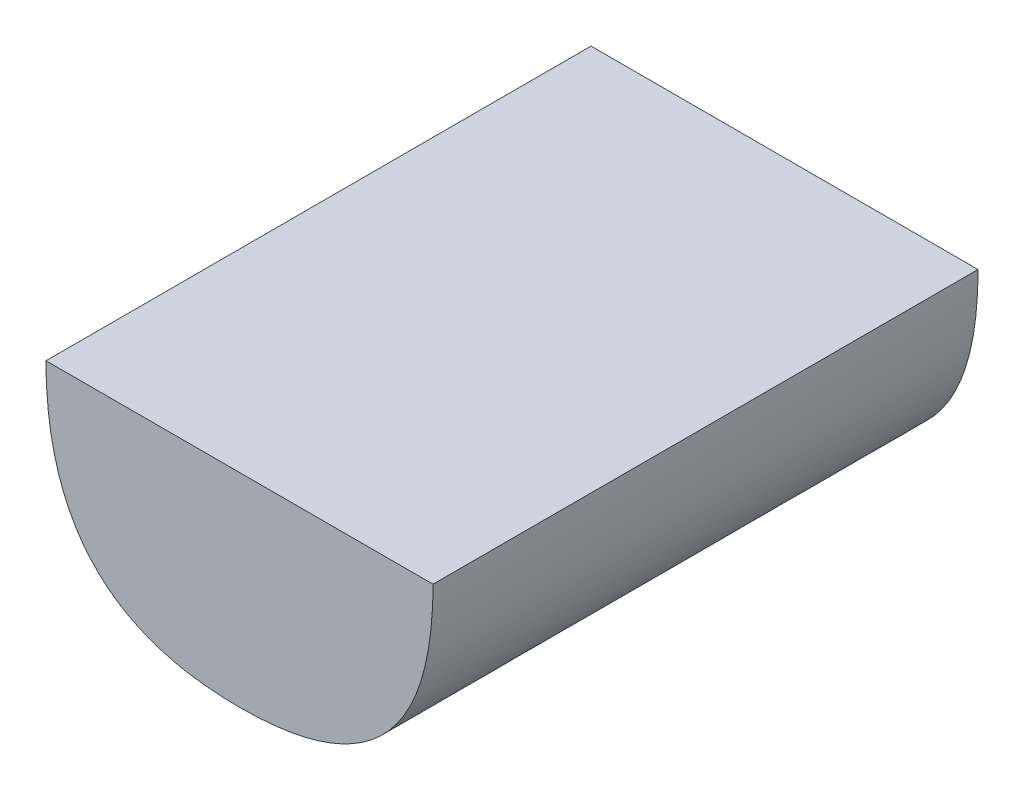
ISO-10303-21;
HEADER;
FILE_DESCRIPTION(('STEP AP214'),'2;1');
FILE_NAME('part.step','',(''),(''),'','','');
FILE_SCHEMA(('AUTOMOTIVE_DESIGN { 1 0 10303 214 1 1 1 1 }'));
ENDSEC;
DATA;
#1=APPLICATION_CONTEXT('core data for automotive mechanical design processes');
#2=APPLICATION_PROTOCOL_DEFINITION('international standard','automotive_design',2000,#1);
#3=PRODUCT_CONTEXT('',#1,'mechanical');
#4=PRODUCT('Part','Part','',(#3));
#5=PRODUCT_RELATED_PRODUCT_CATEGORY('part','',(#4));
#6=PRODUCT_DEFINITION_FORMATION('','',#4);
#7=PRODUCT_DEFINITION_CONTEXT('part definition',#1,'design');
#8=PRODUCT_DEFINITION('design','',#6,#7);
#9=PRODUCT_DEFINITION_SHAPE('','',#8);
#10=(LENGTH_UNIT() NAMED_UNIT(*) SI_UNIT(.MILLI.,.METRE.));
#11=(NAMED_UNIT(*) PLANE_ANGLE_UNIT() SI_UNIT($,.RADIAN.));
#12=(NAMED_UNIT(*) SI_UNIT($,.STERADIAN.) SOLID_ANGLE_UNIT());
#13=UNCERTAINTY_MEASURE_WITH_UNIT(LENGTH_MEASURE(1.E-05),#10,'distance_accuracy_value','');
#14=(GEOMETRIC_REPRESENTATION_CONTEXT(3) GLOBAL_UNCERTAINTY_ASSIGNED_CONTEXT((#13)) GLOBAL_UNIT_ASSIGNED_CONTEXT((#10,
#11,#12)) REPRESENTATION_CONTEXT('',''));
#15=CARTESIAN_POINT('',(0.,0.,0.));
#16=DIRECTION('',(0.,0.,1.));
#17=DIRECTION('',(1.,0.,0.));
#18=AXIS2_PLACEMENT_3D('',#15,#16,#17);
#19=CARTESIAN_POINT('',(0.,0.,-851.662));
#20=CARTESIAN_POINT('',(-302.357037840975,-0.0664450020700911,-851.662));
#21=CARTESIAN_POINT('',(-302.357037840975,317.813001305344,-851.662));
#22=(BOUNDED_CURVE() B_SPLINE_CURVE(2,(#19,#20,#21),.UNSPECIFIED.,.F.,
.F.) B_SPLINE_CURVE_WITH_KNOTS((3,3),(0.,1.),
.UNSPECIFIED.) CURVE() GEOMETRIC_REPRESENTATION_ITEM() RATIONAL_B_SPLINE_CURVE((1.,
1.01936959538977,1.)) REPRESENTATION_ITEM(''));
#23=DIRECTION('',(0.,0.,1.));
#24=VECTOR('',#23,1.);
#25=SURFACE_OF_LINEAR_EXTRUSION('',#22,#24);
#26=CARTESIAN_POINT('',(0.,0.,0.));
#27=CARTESIAN_POINT('',(-302.357037840975,-0.0664450020700911,0.));
#28=CARTESIAN_POINT('',(-302.357037840975,317.813001305344,0.));
#29=(BOUNDED_CURVE() B_SPLINE_CURVE(2,(#26,#27,#28),.UNSPECIFIED.,.F.,
.F.) B_SPLINE_CURVE_WITH_KNOTS((3,3),(0.,1.),
.UNSPECIFIED.) CURVE() GEOMETRIC_REPRESENTATION_ITEM() RATIONAL_B_SPLINE_CURVE((1.,
1.01936959538977,1.)) REPRESENTATION_ITEM(''));
#30=CARTESIAN_POINT('',(0.,0.,0.));
#31=VERTEX_POINT('',#30);
#32=CARTESIAN_POINT('',(-302.357037840975,317.813001305344,0.));
#33=VERTEX_POINT('',#32);
#34=EDGE_CURVE('E88',#31,#33,#29,.T.);
#35=ORIENTED_EDGE('',*,*,#34,.T.);
#36=DIRECTION('',(0.,0.,1.));
#37=VECTOR('',#36,1.);
#38=CARTESIAN_POINT('',(-302.357037840975,317.813001305344,-851.662));
#39=LINE('',#38,#37);
#40=CARTESIAN_POINT('',(-302.357037840975,317.813001305344,-851.662));
#41=VERTEX_POINT('',#40);
#42=EDGE_CURVE('E11',#41,#33,#39,.T.);
#43=ORIENTED_EDGE('',*,*,#42,.F.);
#44=CARTESIAN_POINT('',(0.,0.,-851.662));
#45=VERTEX_POINT('',#44);
#46=EDGE_CURVE('E83',#45,#41,#22,.T.);
#47=ORIENTED_EDGE('',*,*,#46,.F.);
#48=DIRECTION('',(0.,0.,1.));
#49=VECTOR('',#48,1.);
#50=CARTESIAN_POINT('',(0.,0.,-851.662));
#51=LINE('',#50,#49);
#52=EDGE_CURVE('E57',#45,#31,#51,.T.);
#53=ORIENTED_EDGE('',*,*,#52,.T.);
#54=EDGE_LOOP('',(#35,#43,#47,#53));
#55=FACE_BOUND('',#54,.T.);
#56=ADVANCED_FACE('F39',(#55),#25,.F.);
#57=CARTESIAN_POINT('',(-302.357037840975,317.813001305344,-851.662));
#58=DIRECTION('',(0.,-1.,0.));
#59=DIRECTION('',(0.,0.,-1.));
#60=AXIS2_PLACEMENT_3D('',#57,#58,#59);
#61=PLANE('',#60);
#62=DIRECTION('',(1.,0.,0.));
#63=VECTOR('',#62,1.);
#64=CARTESIAN_POINT('',(-302.357037840975,317.813001305344,0.));
#65=LINE('',#64,#63);
#66=CARTESIAN_POINT('',(302.357037840975,317.813001305344,0.));
#67=VERTEX_POINT('',#66);
#68=EDGE_CURVE('E92',#33,#67,#65,.T.);
#69=ORIENTED_EDGE('',*,*,#68,.T.);
#70=DIRECTION('',(0.,0.,1.));
#71=VECTOR('',#70,1.);
#72=CARTESIAN_POINT('',(302.357037840975,317.813001305344,-851.662));
#73=LINE('',#72,#71);
#74=CARTESIAN_POINT('',(302.357037840975,317.813001305344,-851.662));
#75=VERTEX_POINT('',#74);
#76=EDGE_CURVE('E49',#75,#67,#73,.T.);
#77=ORIENTED_EDGE('',*,*,#76,.F.);
#78=DIRECTION('',(1.,0.,0.));
#79=VECTOR('',#78,1.);
#80=CARTESIAN_POINT('',(-302.357037840975,317.813001305344,-851.662));
#81=LINE('',#80,#79);
#82=EDGE_CURVE('E75',#41,#75,#81,.T.);
#83=ORIENTED_EDGE('',*,*,#82,.F.);
#84=ORIENTED_EDGE('',*,*,#42,.T.);
#85=EDGE_LOOP('',(#69,#77,#83,#84));
#86=FACE_BOUND('',#85,.T.);
#87=ADVANCED_FACE('F77',(#86),#61,.F.);
#88=CARTESIAN_POINT('',(0.,0.,-851.662));
#89=CARTESIAN_POINT('',(302.357037840975,-0.0664450020700911,-851.662));
#90=CARTESIAN_POINT('',(302.357037840975,317.813001305344,-851.662));
#91=(BOUNDED_CURVE() B_SPLINE_CURVE(2,(#88,#89,#90),.UNSPECIFIED.,.F.,
.F.) B_SPLINE_CURVE_WITH_KNOTS((3,3),(0.,1.),
.UNSPECIFIED.) CURVE() GEOMETRIC_REPRESENTATION_ITEM() RATIONAL_B_SPLINE_CURVE((1.,
1.01936959538977,1.)) REPRESENTATION_ITEM(''));
#92=DIRECTION('',(0.,0.,1.));
#93=VECTOR('',#92,1.);
#94=SURFACE_OF_LINEAR_EXTRUSION('',#91,#93);
#95=CARTESIAN_POINT('',(0.,0.,0.));
#96=CARTESIAN_POINT('',(302.357037840975,-0.0664450020700911,0.));
#97=CARTESIAN_POINT('',(302.357037840975,317.813001305344,0.));
#98=(BOUNDED_CURVE() B_SPLINE_CURVE(2,(#95,#96,#97),.UNSPECIFIED.,.F.,
.F.) B_SPLINE_CURVE_WITH_KNOTS((3,3),(0.,1.),
.UNSPECIFIED.) CURVE() GEOMETRIC_REPRESENTATION_ITEM() RATIONAL_B_SPLINE_CURVE((1.,
1.01936959538977,1.)) REPRESENTATION_ITEM(''));
#99=EDGE_CURVE('E87',#31,#67,#98,.T.);
#100=ORIENTED_EDGE('',*,*,#99,.F.);
#101=ORIENTED_EDGE('',*,*,#52,.F.);
#102=EDGE_CURVE('E82',#45,#75,#91,.T.);
#103=ORIENTED_EDGE('',*,*,#102,.T.);
#104=ORIENTED_EDGE('',*,*,#76,.T.);
#105=EDGE_LOOP('',(#100,#101,#103,#104));
#106=FACE_BOUND('',#105,.T.);
#107=ADVANCED_FACE('F116',(#106),#94,.T.);
#108=CARTESIAN_POINT('',(-227.492823154556,78.6576013625369,-851.662));
#109=DIRECTION('',(0.,0.,1.));
#110=DIRECTION('',(1.,0.,0.));
#111=AXIS2_PLACEMENT_3D('',#108,#109,#110);
#112=PLANE('',#111);
#113=ORIENTED_EDGE('',*,*,#46,.T.);
#114=ORIENTED_EDGE('',*,*,#82,.T.);
#115=ORIENTED_EDGE('',*,*,#102,.F.);
#116=EDGE_LOOP('',(#113,#114,#115));
#117=FACE_BOUND('',#116,.T.);
#118=ADVANCED_FACE('F85',(#117),#112,.F.);
#119=CARTESIAN_POINT('',(-227.492823154556,78.6576013625369,0.));
#120=DIRECTION('',(0.,0.,1.));
#121=DIRECTION('',(1.,0.,0.));
#122=AXIS2_PLACEMENT_3D('',#119,#120,#121);
#123=PLANE('',#122);
#124=ORIENTED_EDGE('',*,*,#34,.F.);
#125=ORIENTED_EDGE('',*,*,#99,.T.);
#126=ORIENTED_EDGE('',*,*,#68,.F.);
#127=EDGE_LOOP('',(#124,#125,#126));
#128=FACE_BOUND('',#127,.T.);
#129=ADVANCED_FACE('F123',(#128),#123,.T.);
#130=CLOSED_SHELL('',(#56,#87,#107,#118,#129));
#131=MANIFOLD_SOLID_BREP('B2',#130);
#132=ADVANCED_BREP_SHAPE_REPRESENTATION('',(#18,#131),#14);
#133=SHAPE_DEFINITION_REPRESENTATION(#9,#132);
ENDSEC;
END-ISO-10303-21;
